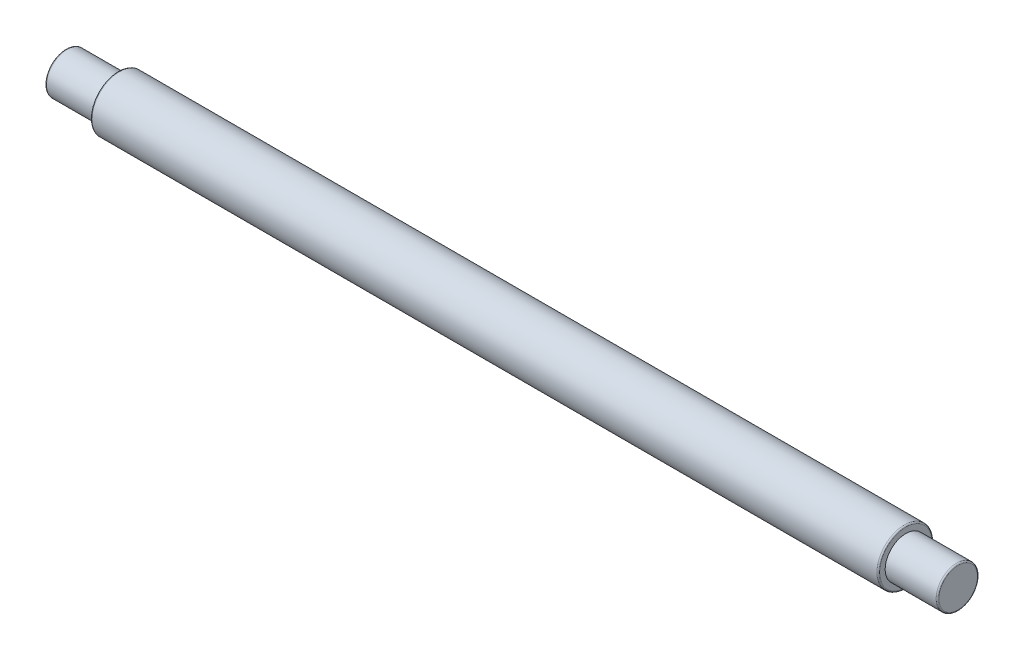
ISO-10303-21;
HEADER;
FILE_DESCRIPTION(('STEP AP214'),'2;1');
FILE_NAME('part.step','',(''),(''),'','','');
FILE_SCHEMA(('AUTOMOTIVE_DESIGN { 1 0 10303 214 1 1 1 1 }'));
ENDSEC;
DATA;
#1=APPLICATION_CONTEXT('core data for automotive mechanical design processes');
#2=APPLICATION_PROTOCOL_DEFINITION('international standard','automotive_design',2000,#1);
#3=PRODUCT_CONTEXT('',#1,'mechanical');
#4=PRODUCT('Part','Part','',(#3));
#5=PRODUCT_RELATED_PRODUCT_CATEGORY('part','',(#4));
#6=PRODUCT_DEFINITION_FORMATION('','',#4);
#7=PRODUCT_DEFINITION_CONTEXT('part definition',#1,'design');
#8=PRODUCT_DEFINITION('design','',#6,#7);
#9=PRODUCT_DEFINITION_SHAPE('','',#8);
#10=(LENGTH_UNIT() NAMED_UNIT(*) SI_UNIT(.MILLI.,.METRE.));
#11=(NAMED_UNIT(*) PLANE_ANGLE_UNIT() SI_UNIT($,.RADIAN.));
#12=(NAMED_UNIT(*) SI_UNIT($,.STERADIAN.) SOLID_ANGLE_UNIT());
#13=UNCERTAINTY_MEASURE_WITH_UNIT(LENGTH_MEASURE(1.E-05),#10,'distance_accuracy_value','');
#14=(GEOMETRIC_REPRESENTATION_CONTEXT(3) GLOBAL_UNCERTAINTY_ASSIGNED_CONTEXT((#13)) GLOBAL_UNIT_ASSIGNED_CONTEXT((#10,
#11,#12)) REPRESENTATION_CONTEXT('',''));
#15=CARTESIAN_POINT('',(0.,0.,0.));
#16=DIRECTION('',(0.,0.,1.));
#17=DIRECTION('',(1.,0.,0.));
#18=AXIS2_PLACEMENT_3D('',#15,#16,#17);
#19=CARTESIAN_POINT('',(-324.,0.,0.));
#20=DIRECTION('',(1.,0.,0.));
#21=DIRECTION('',(0.,1.,0.));
#22=AXIS2_PLACEMENT_3D('',#19,#20,#21);
#23=PLANE('',#22);
#24=CARTESIAN_POINT('',(-324.,0.,0.));
#25=DIRECTION('',(1.,0.,0.));
#26=DIRECTION('',(0.,1.,0.));
#27=AXIS2_PLACEMENT_3D('',#24,#25,#26);
#28=CIRCLE('',#27,14.);
#29=CARTESIAN_POINT('',(-324.,14.,0.));
#30=VERTEX_POINT('',#29);
#31=EDGE_CURVE('E39',#30,#30,#28,.F.);
#32=ORIENTED_EDGE('',*,*,#31,.T.);
#33=EDGE_LOOP('',(#32));
#34=FACE_BOUND('',#33,.T.);
#35=ADVANCED_FACE('F32',(#34),#23,.F.);
#36=CARTESIAN_POINT('',(-324.,0.,0.));
#37=DIRECTION('',(-1.,0.,0.));
#38=DIRECTION('',(0.,-1.,0.));
#39=AXIS2_PLACEMENT_3D('',#36,#37,#38);
#40=CYLINDRICAL_SURFACE('',#39,15.);
#41=CARTESIAN_POINT('',(-323.,0.,0.));
#42=DIRECTION('',(1.,0.,0.));
#43=DIRECTION('',(0.,1.,0.));
#44=AXIS2_PLACEMENT_3D('',#41,#42,#43);
#45=CIRCLE('',#44,15.);
#46=CARTESIAN_POINT('',(-323.,15.,0.));
#47=VERTEX_POINT('',#46);
#48=EDGE_CURVE('E10',#47,#47,#45,.T.);
#49=ORIENTED_EDGE('',*,*,#48,.T.);
#50=EDGE_LOOP('',(#49));
#51=FACE_BOUND('',#50,.T.);
#52=CARTESIAN_POINT('',(-286.,0.,0.));
#53=DIRECTION('',(-1.,0.,0.));
#54=DIRECTION('',(0.,-1.,0.));
#55=AXIS2_PLACEMENT_3D('',#52,#53,#54);
#56=CIRCLE('',#55,15.);
#57=CARTESIAN_POINT('',(-286.,-15.,0.));
#58=VERTEX_POINT('',#57);
#59=EDGE_CURVE('E64',#58,#58,#56,.T.);
#60=ORIENTED_EDGE('',*,*,#59,.T.);
#61=EDGE_LOOP('',(#60));
#62=FACE_BOUND('',#61,.T.);
#63=ADVANCED_FACE('F89',(#51,#62),#40,.T.);
#64=CARTESIAN_POINT('',(-286.,15.,0.));
#65=DIRECTION('',(1.,0.,0.));
#66=DIRECTION('',(0.,1.,0.));
#67=AXIS2_PLACEMENT_3D('',#64,#65,#66);
#68=PLANE('',#67);
#69=CARTESIAN_POINT('',(-286.,0.,0.));
#70=DIRECTION('',(1.,0.,0.));
#71=DIRECTION('',(0.,1.,0.));
#72=AXIS2_PLACEMENT_3D('',#69,#70,#71);
#73=CIRCLE('',#72,18.9999999999999);
#74=CARTESIAN_POINT('',(-286.,18.9999999999999,0.));
#75=VERTEX_POINT('',#74);
#76=EDGE_CURVE('E43',#75,#75,#73,.F.);
#77=ORIENTED_EDGE('',*,*,#76,.T.);
#78=EDGE_LOOP('',(#77));
#79=FACE_BOUND('',#78,.T.);
#80=ORIENTED_EDGE('',*,*,#59,.F.);
#81=EDGE_LOOP('',(#80));
#82=FACE_BOUND('',#81,.T.);
#83=ADVANCED_FACE('F94',(#79,#82),#68,.F.);
#84=CARTESIAN_POINT('',(-324.,0.,0.));
#85=DIRECTION('',(-1.,0.,0.));
#86=DIRECTION('',(0.,-1.,0.));
#87=AXIS2_PLACEMENT_3D('',#84,#85,#86);
#88=CYLINDRICAL_SURFACE('',#87,19.9999999999999);
#89=CARTESIAN_POINT('',(285.,1.11871485102111E-13,0.));
#90=DIRECTION('',(-1.,0.,0.));
#91=DIRECTION('',(0.,-1.,0.));
#92=AXIS2_PLACEMENT_3D('',#89,#90,#91);
#93=CIRCLE('',#92,19.9999999999999);
#94=CARTESIAN_POINT('',(285.,-19.9999999999998,0.));
#95=VERTEX_POINT('',#94);
#96=EDGE_CURVE('E52',#95,#95,#93,.T.);
#97=ORIENTED_EDGE('',*,*,#96,.T.);
#98=EDGE_LOOP('',(#97));
#99=FACE_BOUND('',#98,.T.);
#100=CARTESIAN_POINT('',(-285.,0.,0.));
#101=DIRECTION('',(1.,0.,0.));
#102=DIRECTION('',(0.,1.,0.));
#103=AXIS2_PLACEMENT_3D('',#100,#101,#102);
#104=CIRCLE('',#103,19.9999999999999);
#105=CARTESIAN_POINT('',(-285.,19.9999999999999,0.));
#106=VERTEX_POINT('',#105);
#107=EDGE_CURVE('E55',#106,#106,#104,.T.);
#108=ORIENTED_EDGE('',*,*,#107,.T.);
#109=EDGE_LOOP('',(#108));
#110=FACE_BOUND('',#109,.T.);
#111=ADVANCED_FACE('F85',(#99,#110),#88,.T.);
#112=CARTESIAN_POINT('',(286.,20.,0.));
#113=DIRECTION('',(-1.,0.,0.));
#114=DIRECTION('',(0.,-1.,0.));
#115=AXIS2_PLACEMENT_3D('',#112,#113,#114);
#116=PLANE('',#115);
#117=CARTESIAN_POINT('',(286.,1.12055182121983E-13,0.));
#118=DIRECTION('',(-1.,0.,0.));
#119=DIRECTION('',(0.,-1.,0.));
#120=AXIS2_PLACEMENT_3D('',#117,#118,#119);
#121=CIRCLE('',#120,18.9999999999999);
#122=CARTESIAN_POINT('',(286.,-18.9999999999998,0.));
#123=VERTEX_POINT('',#122);
#124=EDGE_CURVE('E47',#123,#123,#121,.F.);
#125=ORIENTED_EDGE('',*,*,#124,.T.);
#126=EDGE_LOOP('',(#125));
#127=FACE_BOUND('',#126,.T.);
#128=CARTESIAN_POINT('',(286.,1.12055182121983E-13,0.));
#129=DIRECTION('',(-1.,0.,0.));
#130=DIRECTION('',(0.,-1.,0.));
#131=AXIS2_PLACEMENT_3D('',#128,#129,#130);
#132=CIRCLE('',#131,14.9999999999999);
#133=CARTESIAN_POINT('',(286.,-14.9999999999998,0.));
#134=VERTEX_POINT('',#133);
#135=EDGE_CURVE('E67',#134,#134,#132,.T.);
#136=ORIENTED_EDGE('',*,*,#135,.T.);
#137=EDGE_LOOP('',(#136));
#138=FACE_BOUND('',#137,.T.);
#139=ADVANCED_FACE('F71',(#127,#138),#116,.F.);
#140=CARTESIAN_POINT('',(-324.,0.,0.));
#141=DIRECTION('',(-1.,0.,0.));
#142=DIRECTION('',(0.,-1.,0.));
#143=AXIS2_PLACEMENT_3D('',#140,#141,#142);
#144=CYLINDRICAL_SURFACE('',#143,14.9999999999999);
#145=CARTESIAN_POINT('',(323.,1.18851971857251E-13,0.));
#146=DIRECTION('',(-1.,0.,0.));
#147=DIRECTION('',(0.,-1.,0.));
#148=AXIS2_PLACEMENT_3D('',#145,#146,#147);
#149=CIRCLE('',#148,14.9999999999999);
#150=CARTESIAN_POINT('',(323.,-14.9999999999998,0.));
#151=VERTEX_POINT('',#150);
#152=EDGE_CURVE('E61',#151,#151,#149,.T.);
#153=ORIENTED_EDGE('',*,*,#152,.T.);
#154=EDGE_LOOP('',(#153));
#155=FACE_BOUND('',#154,.T.);
#156=ORIENTED_EDGE('',*,*,#135,.F.);
#157=EDGE_LOOP('',(#156));
#158=FACE_BOUND('',#157,.T.);
#159=ADVANCED_FACE('F73',(#155,#158),#144,.T.);
#160=CARTESIAN_POINT('',(324.,15.,0.));
#161=DIRECTION('',(-1.,0.,0.));
#162=DIRECTION('',(0.,-1.,0.));
#163=AXIS2_PLACEMENT_3D('',#160,#161,#162);
#164=PLANE('',#163);
#165=CARTESIAN_POINT('',(324.,1.19035668877123E-13,0.));
#166=DIRECTION('',(-1.,0.,0.));
#167=DIRECTION('',(0.,-1.,0.));
#168=AXIS2_PLACEMENT_3D('',#165,#166,#167);
#169=CIRCLE('',#168,13.9999999999999);
#170=CARTESIAN_POINT('',(324.,-13.9999999999998,0.));
#171=VERTEX_POINT('',#170);
#172=EDGE_CURVE('E58',#171,#171,#169,.F.);
#173=ORIENTED_EDGE('',*,*,#172,.T.);
#174=EDGE_LOOP('',(#173));
#175=FACE_BOUND('',#174,.T.);
#176=ADVANCED_FACE('F75',(#175),#164,.F.);
#177=CARTESIAN_POINT('',(323.,1.18851971857251E-13,0.));
#178=DIRECTION('',(-1.,0.,0.));
#179=DIRECTION('',(0.,-1.,0.));
#180=AXIS2_PLACEMENT_3D('',#177,#178,#179);
#181=TOROIDAL_SURFACE('',#180,13.9999999999999,1.);
#182=ORIENTED_EDGE('',*,*,#172,.F.);
#183=EDGE_LOOP('',(#182));
#184=FACE_BOUND('',#183,.T.);
#185=ORIENTED_EDGE('',*,*,#152,.F.);
#186=EDGE_LOOP('',(#185));
#187=FACE_BOUND('',#186,.T.);
#188=ADVANCED_FACE('F82',(#184,#187),#181,.T.);
#189=CARTESIAN_POINT('',(285.,1.11871485102111E-13,0.));
#190=DIRECTION('',(-1.,0.,0.));
#191=DIRECTION('',(0.,-1.,0.));
#192=AXIS2_PLACEMENT_3D('',#189,#190,#191);
#193=TOROIDAL_SURFACE('',#192,18.9999999999999,1.);
#194=ORIENTED_EDGE('',*,*,#124,.F.);
#195=EDGE_LOOP('',(#194));
#196=FACE_BOUND('',#195,.T.);
#197=ORIENTED_EDGE('',*,*,#96,.F.);
#198=EDGE_LOOP('',(#197));
#199=FACE_BOUND('',#198,.T.);
#200=ADVANCED_FACE('F100',(#196,#199),#193,.T.);
#201=CARTESIAN_POINT('',(-285.,0.,0.));
#202=DIRECTION('',(1.,0.,0.));
#203=DIRECTION('',(0.,1.,0.));
#204=AXIS2_PLACEMENT_3D('',#201,#202,#203);
#205=TOROIDAL_SURFACE('',#204,18.9999999999999,1.);
#206=ORIENTED_EDGE('',*,*,#107,.F.);
#207=EDGE_LOOP('',(#206));
#208=FACE_BOUND('',#207,.T.);
#209=ORIENTED_EDGE('',*,*,#76,.F.);
#210=EDGE_LOOP('',(#209));
#211=FACE_BOUND('',#210,.T.);
#212=ADVANCED_FACE('F103',(#208,#211),#205,.T.);
#213=CARTESIAN_POINT('',(-323.,0.,0.));
#214=DIRECTION('',(1.,0.,0.));
#215=DIRECTION('',(0.,1.,0.));
#216=AXIS2_PLACEMENT_3D('',#213,#214,#215);
#217=TOROIDAL_SURFACE('',#216,14.,1.);
#218=ORIENTED_EDGE('',*,*,#48,.F.);
#219=EDGE_LOOP('',(#218));
#220=FACE_BOUND('',#219,.T.);
#221=ORIENTED_EDGE('',*,*,#31,.F.);
#222=EDGE_LOOP('',(#221));
#223=FACE_BOUND('',#222,.T.);
#224=ADVANCED_FACE('F34',(#220,#223),#217,.T.);
#225=CLOSED_SHELL('',(#35,#63,#83,#111,#139,#159,#176,#188,#200,#212,#224));
#226=MANIFOLD_SOLID_BREP('B2',#225);
#227=ADVANCED_BREP_SHAPE_REPRESENTATION('',(#18,#226),#14);
#228=SHAPE_DEFINITION_REPRESENTATION(#9,#227);
ENDSEC;
END-ISO-10303-21;
